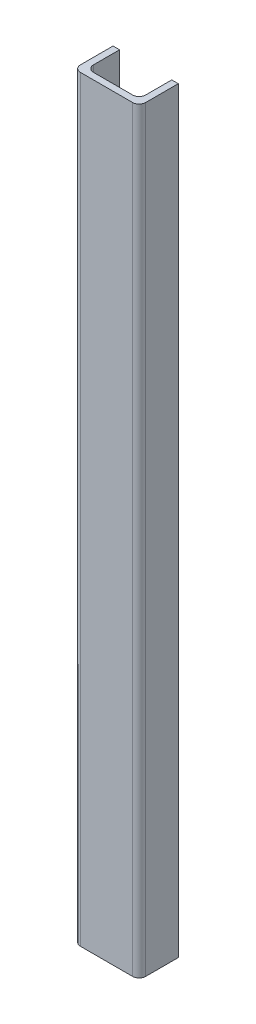
ISO-10303-21;
HEADER;
FILE_DESCRIPTION(('STEP AP214'),'2;1');
FILE_NAME('part.step','',(''),(''),'','','');
FILE_SCHEMA(('AUTOMOTIVE_DESIGN { 1 0 10303 214 1 1 1 1 }'));
ENDSEC;
DATA;
#1=APPLICATION_CONTEXT('core data for automotive mechanical design processes');
#2=APPLICATION_PROTOCOL_DEFINITION('international standard','automotive_design',2000,#1);
#3=PRODUCT_CONTEXT('',#1,'mechanical');
#4=PRODUCT('Part','Part','',(#3));
#5=PRODUCT_RELATED_PRODUCT_CATEGORY('part','',(#4));
#6=PRODUCT_DEFINITION_FORMATION('','',#4);
#7=PRODUCT_DEFINITION_CONTEXT('part definition',#1,'design');
#8=PRODUCT_DEFINITION('design','',#6,#7);
#9=PRODUCT_DEFINITION_SHAPE('','',#8);
#10=(LENGTH_UNIT() NAMED_UNIT(*) SI_UNIT(.MILLI.,.METRE.));
#11=(NAMED_UNIT(*) PLANE_ANGLE_UNIT() SI_UNIT($,.RADIAN.));
#12=(NAMED_UNIT(*) SI_UNIT($,.STERADIAN.) SOLID_ANGLE_UNIT());
#13=UNCERTAINTY_MEASURE_WITH_UNIT(LENGTH_MEASURE(1.E-05),#10,'distance_accuracy_value','');
#14=(GEOMETRIC_REPRESENTATION_CONTEXT(3) GLOBAL_UNCERTAINTY_ASSIGNED_CONTEXT((#13)) GLOBAL_UNIT_ASSIGNED_CONTEXT((#10,
#11,#12)) REPRESENTATION_CONTEXT('',''));
#15=CARTESIAN_POINT('',(0.,0.,0.));
#16=DIRECTION('',(0.,0.,1.));
#17=DIRECTION('',(1.,0.,0.));
#18=AXIS2_PLACEMENT_3D('',#15,#16,#17);
#19=CARTESIAN_POINT('',(20.,580.,-2.5));
#20=DIRECTION('',(0.,-1.,0.));
#21=DIRECTION('',(0.,0.,-1.));
#22=AXIS2_PLACEMENT_3D('',#19,#20,#21);
#23=CYLINDRICAL_SURFACE('',#22,5.);
#24=CARTESIAN_POINT('',(20.,0.,-2.5));
#25=DIRECTION('',(0.,1.,0.));
#26=DIRECTION('',(0.,0.,1.));
#27=AXIS2_PLACEMENT_3D('',#24,#25,#26);
#28=CIRCLE('',#27,5.);
#29=CARTESIAN_POINT('',(20.,0.,2.5));
#30=VERTEX_POINT('',#29);
#31=CARTESIAN_POINT('',(25.,0.,-2.50000000000004));
#32=VERTEX_POINT('',#31);
#33=EDGE_CURVE('E157',#30,#32,#28,.T.);
#34=ORIENTED_EDGE('',*,*,#33,.T.);
#35=DIRECTION('',(0.,-1.,0.));
#36=VECTOR('',#35,1.);
#37=CARTESIAN_POINT('',(25.,580.,-2.50000000000004));
#38=LINE('',#37,#36);
#39=CARTESIAN_POINT('',(25.,580.,-2.50000000000004));
#40=VERTEX_POINT('',#39);
#41=EDGE_CURVE('E11',#40,#32,#38,.T.);
#42=ORIENTED_EDGE('',*,*,#41,.F.);
#43=CARTESIAN_POINT('',(20.,580.,-2.5));
#44=DIRECTION('',(0.,1.,0.));
#45=DIRECTION('',(0.,0.,1.));
#46=AXIS2_PLACEMENT_3D('',#43,#44,#45);
#47=CIRCLE('',#46,5.);
#48=CARTESIAN_POINT('',(20.,580.,2.5));
#49=VERTEX_POINT('',#48);
#50=EDGE_CURVE('E179',#49,#40,#47,.T.);
#51=ORIENTED_EDGE('',*,*,#50,.F.);
#52=DIRECTION('',(0.,-1.,0.));
#53=VECTOR('',#52,1.);
#54=CARTESIAN_POINT('',(20.,580.,2.5));
#55=LINE('',#54,#53);
#56=EDGE_CURVE('E153',#49,#30,#55,.T.);
#57=ORIENTED_EDGE('',*,*,#56,.T.);
#58=EDGE_LOOP('',(#34,#42,#51,#57));
#59=FACE_BOUND('',#58,.T.);
#60=ADVANCED_FACE('F37',(#59),#23,.T.);
#61=CARTESIAN_POINT('',(25.,580.,-2.50000000000004));
#62=DIRECTION('',(-1.,0.,0.));
#63=DIRECTION('',(0.,0.,1.));
#64=AXIS2_PLACEMENT_3D('',#61,#62,#63);
#65=PLANE('',#64);
#66=DIRECTION('',(0.,0.,-1.));
#67=VECTOR('',#66,1.);
#68=CARTESIAN_POINT('',(25.,0.,-2.50000000000004));
#69=LINE('',#68,#67);
#70=CARTESIAN_POINT('',(25.,0.,-27.5));
#71=VERTEX_POINT('',#70);
#72=EDGE_CURVE('E160',#32,#71,#69,.T.);
#73=ORIENTED_EDGE('',*,*,#72,.T.);
#74=DIRECTION('',(0.,-1.,0.));
#75=VECTOR('',#74,1.);
#76=CARTESIAN_POINT('',(25.,580.,-27.5));
#77=LINE('',#76,#75);
#78=CARTESIAN_POINT('',(25.,580.,-27.5));
#79=VERTEX_POINT('',#78);
#80=EDGE_CURVE('E45',#79,#71,#77,.T.);
#81=ORIENTED_EDGE('',*,*,#80,.F.);
#82=DIRECTION('',(0.,0.,-1.));
#83=VECTOR('',#82,1.);
#84=CARTESIAN_POINT('',(25.,580.,-2.50000000000004));
#85=LINE('',#84,#83);
#86=EDGE_CURVE('E108',#40,#79,#85,.T.);
#87=ORIENTED_EDGE('',*,*,#86,.F.);
#88=ORIENTED_EDGE('',*,*,#41,.T.);
#89=EDGE_LOOP('',(#73,#81,#87,#88));
#90=FACE_BOUND('',#89,.T.);
#91=ADVANCED_FACE('F257',(#90),#65,.F.);
#92=CARTESIAN_POINT('',(25.,580.,-27.5));
#93=DIRECTION('',(0.,0.,1.));
#94=DIRECTION('',(1.,0.,0.));
#95=AXIS2_PLACEMENT_3D('',#92,#93,#94);
#96=PLANE('',#95);
#97=DIRECTION('',(-1.,0.,0.));
#98=VECTOR('',#97,1.);
#99=CARTESIAN_POINT('',(25.,0.,-27.5));
#100=LINE('',#99,#98);
#101=CARTESIAN_POINT('',(20.,0.,-27.5));
#102=VERTEX_POINT('',#101);
#103=EDGE_CURVE('E162',#71,#102,#100,.T.);
#104=ORIENTED_EDGE('',*,*,#103,.T.);
#105=DIRECTION('',(0.,-1.,0.));
#106=VECTOR('',#105,1.);
#107=CARTESIAN_POINT('',(20.,580.,-27.5));
#108=LINE('',#107,#106);
#109=CARTESIAN_POINT('',(20.,580.,-27.5));
#110=VERTEX_POINT('',#109);
#111=EDGE_CURVE('E198',#110,#102,#108,.T.);
#112=ORIENTED_EDGE('',*,*,#111,.F.);
#113=DIRECTION('',(-1.,0.,0.));
#114=VECTOR('',#113,1.);
#115=CARTESIAN_POINT('',(25.,580.,-27.5));
#116=LINE('',#115,#114);
#117=EDGE_CURVE('E206',#79,#110,#116,.T.);
#118=ORIENTED_EDGE('',*,*,#117,.F.);
#119=ORIENTED_EDGE('',*,*,#80,.T.);
#120=EDGE_LOOP('',(#104,#112,#118,#119));
#121=FACE_BOUND('',#120,.T.);
#122=ADVANCED_FACE('F204',(#121),#96,.F.);
#123=CARTESIAN_POINT('',(20.,580.,-7.50000000000003));
#124=DIRECTION('',(1.,0.,0.));
#125=DIRECTION('',(0.,0.,-1.));
#126=AXIS2_PLACEMENT_3D('',#123,#124,#125);
#127=PLANE('',#126);
#128=DIRECTION('',(0.,0.,1.));
#129=VECTOR('',#128,1.);
#130=CARTESIAN_POINT('',(20.,0.,-7.50000000000003));
#131=LINE('',#130,#129);
#132=CARTESIAN_POINT('',(20.,0.,-7.50000000000003));
#133=VERTEX_POINT('',#132);
#134=EDGE_CURVE('E164',#102,#133,#131,.T.);
#135=ORIENTED_EDGE('',*,*,#134,.T.);
#136=DIRECTION('',(0.,-1.,0.));
#137=VECTOR('',#136,1.);
#138=CARTESIAN_POINT('',(20.,580.,-7.50000000000003));
#139=LINE('',#138,#137);
#140=CARTESIAN_POINT('',(20.,580.,-7.50000000000003));
#141=VERTEX_POINT('',#140);
#142=EDGE_CURVE('E195',#141,#133,#139,.T.);
#143=ORIENTED_EDGE('',*,*,#142,.F.);
#144=DIRECTION('',(0.,0.,1.));
#145=VECTOR('',#144,1.);
#146=CARTESIAN_POINT('',(20.,580.,-7.50000000000003));
#147=LINE('',#146,#145);
#148=EDGE_CURVE('E224',#110,#141,#147,.T.);
#149=ORIENTED_EDGE('',*,*,#148,.F.);
#150=ORIENTED_EDGE('',*,*,#111,.T.);
#151=EDGE_LOOP('',(#135,#143,#149,#150));
#152=FACE_BOUND('',#151,.T.);
#153=ADVANCED_FACE('F215',(#152),#127,.F.);
#154=CARTESIAN_POINT('',(15.,580.,-7.5));
#155=DIRECTION('',(0.,-1.,0.));
#156=DIRECTION('',(0.,0.,-1.));
#157=AXIS2_PLACEMENT_3D('',#154,#155,#156);
#158=CYLINDRICAL_SURFACE('',#157,5.);
#159=CARTESIAN_POINT('',(15.,0.,-7.5));
#160=DIRECTION('',(0.,-1.,0.));
#161=DIRECTION('',(0.,0.,1.));
#162=AXIS2_PLACEMENT_3D('',#159,#160,#161);
#163=CIRCLE('',#162,5.);
#164=CARTESIAN_POINT('',(15.,0.,-2.5));
#165=VERTEX_POINT('',#164);
#166=EDGE_CURVE('E166',#133,#165,#163,.T.);
#167=ORIENTED_EDGE('',*,*,#166,.T.);
#168=DIRECTION('',(0.,-1.,0.));
#169=VECTOR('',#168,1.);
#170=CARTESIAN_POINT('',(15.,580.,-2.5));
#171=LINE('',#170,#169);
#172=CARTESIAN_POINT('',(15.,580.,-2.5));
#173=VERTEX_POINT('',#172);
#174=EDGE_CURVE('E192',#173,#165,#171,.T.);
#175=ORIENTED_EDGE('',*,*,#174,.F.);
#176=CARTESIAN_POINT('',(15.,580.,-7.5));
#177=DIRECTION('',(0.,-1.,0.));
#178=DIRECTION('',(0.,0.,1.));
#179=AXIS2_PLACEMENT_3D('',#176,#177,#178);
#180=CIRCLE('',#179,5.);
#181=EDGE_CURVE('E221',#141,#173,#180,.T.);
#182=ORIENTED_EDGE('',*,*,#181,.F.);
#183=ORIENTED_EDGE('',*,*,#142,.T.);
#184=EDGE_LOOP('',(#167,#175,#182,#183));
#185=FACE_BOUND('',#184,.T.);
#186=ADVANCED_FACE('F219',(#185),#158,.F.);
#187=CARTESIAN_POINT('',(-15.,580.,-2.5));
#188=DIRECTION('',(0.,0.,1.));
#189=DIRECTION('',(1.,0.,0.));
#190=AXIS2_PLACEMENT_3D('',#187,#188,#189);
#191=PLANE('',#190);
#192=DIRECTION('',(-1.,0.,0.));
#193=VECTOR('',#192,1.);
#194=CARTESIAN_POINT('',(-15.,0.,-2.5));
#195=LINE('',#194,#193);
#196=CARTESIAN_POINT('',(-15.,0.,-2.5));
#197=VERTEX_POINT('',#196);
#198=EDGE_CURVE('E168',#165,#197,#195,.T.);
#199=ORIENTED_EDGE('',*,*,#198,.T.);
#200=DIRECTION('',(0.,-1.,0.));
#201=VECTOR('',#200,1.);
#202=CARTESIAN_POINT('',(-15.,580.,-2.5));
#203=LINE('',#202,#201);
#204=CARTESIAN_POINT('',(-15.,580.,-2.5));
#205=VERTEX_POINT('',#204);
#206=EDGE_CURVE('E189',#205,#197,#203,.T.);
#207=ORIENTED_EDGE('',*,*,#206,.F.);
#208=DIRECTION('',(-1.,0.,0.));
#209=VECTOR('',#208,1.);
#210=CARTESIAN_POINT('',(-15.,580.,-2.5));
#211=LINE('',#210,#209);
#212=EDGE_CURVE('E223',#173,#205,#211,.T.);
#213=ORIENTED_EDGE('',*,*,#212,.F.);
#214=ORIENTED_EDGE('',*,*,#174,.T.);
#215=EDGE_LOOP('',(#199,#207,#213,#214));
#216=FACE_BOUND('',#215,.T.);
#217=ADVANCED_FACE('F270',(#216),#191,.F.);
#218=CARTESIAN_POINT('',(-15.,580.,-7.5));
#219=DIRECTION('',(0.,-1.,0.));
#220=DIRECTION('',(0.,0.,-1.));
#221=AXIS2_PLACEMENT_3D('',#218,#219,#220);
#222=CYLINDRICAL_SURFACE('',#221,5.);
#223=CARTESIAN_POINT('',(-15.,0.,-7.5));
#224=DIRECTION('',(0.,-1.,0.));
#225=DIRECTION('',(0.,0.,-1.));
#226=AXIS2_PLACEMENT_3D('',#223,#224,#225);
#227=CIRCLE('',#226,5.);
#228=CARTESIAN_POINT('',(-20.,0.,-7.50000000000003));
#229=VERTEX_POINT('',#228);
#230=EDGE_CURVE('E170',#197,#229,#227,.T.);
#231=ORIENTED_EDGE('',*,*,#230,.T.);
#232=DIRECTION('',(0.,-1.,0.));
#233=VECTOR('',#232,1.);
#234=CARTESIAN_POINT('',(-20.,580.,-7.50000000000003));
#235=LINE('',#234,#233);
#236=CARTESIAN_POINT('',(-20.,580.,-7.50000000000003));
#237=VERTEX_POINT('',#236);
#238=EDGE_CURVE('E186',#237,#229,#235,.T.);
#239=ORIENTED_EDGE('',*,*,#238,.F.);
#240=CARTESIAN_POINT('',(-15.,580.,-7.5));
#241=DIRECTION('',(0.,-1.,0.));
#242=DIRECTION('',(0.,0.,-1.));
#243=AXIS2_PLACEMENT_3D('',#240,#241,#242);
#244=CIRCLE('',#243,5.);
#245=EDGE_CURVE('E226',#205,#237,#244,.T.);
#246=ORIENTED_EDGE('',*,*,#245,.F.);
#247=ORIENTED_EDGE('',*,*,#206,.T.);
#248=EDGE_LOOP('',(#231,#239,#246,#247));
#249=FACE_BOUND('',#248,.T.);
#250=ADVANCED_FACE('F273',(#249),#222,.F.);
#251=CARTESIAN_POINT('',(-20.,580.,-27.5));
#252=DIRECTION('',(-1.,0.,0.));
#253=DIRECTION('',(0.,0.,1.));
#254=AXIS2_PLACEMENT_3D('',#251,#252,#253);
#255=PLANE('',#254);
#256=DIRECTION('',(0.,0.,-1.));
#257=VECTOR('',#256,1.);
#258=CARTESIAN_POINT('',(-20.,0.,-27.5));
#259=LINE('',#258,#257);
#260=CARTESIAN_POINT('',(-20.,0.,-27.5));
#261=VERTEX_POINT('',#260);
#262=EDGE_CURVE('E172',#229,#261,#259,.T.);
#263=ORIENTED_EDGE('',*,*,#262,.T.);
#264=DIRECTION('',(0.,-1.,0.));
#265=VECTOR('',#264,1.);
#266=CARTESIAN_POINT('',(-20.,580.,-27.5));
#267=LINE('',#266,#265);
#268=CARTESIAN_POINT('',(-20.,580.,-27.5));
#269=VERTEX_POINT('',#268);
#270=EDGE_CURVE('E183',#269,#261,#267,.T.);
#271=ORIENTED_EDGE('',*,*,#270,.F.);
#272=DIRECTION('',(0.,0.,-1.));
#273=VECTOR('',#272,1.);
#274=CARTESIAN_POINT('',(-20.,580.,-27.5));
#275=LINE('',#274,#273);
#276=EDGE_CURVE('E232',#237,#269,#275,.T.);
#277=ORIENTED_EDGE('',*,*,#276,.F.);
#278=ORIENTED_EDGE('',*,*,#238,.T.);
#279=EDGE_LOOP('',(#263,#271,#277,#278));
#280=FACE_BOUND('',#279,.T.);
#281=ADVANCED_FACE('F238',(#280),#255,.F.);
#282=CARTESIAN_POINT('',(-25.,580.,-27.5));
#283=DIRECTION('',(0.,0.,1.));
#284=DIRECTION('',(1.,0.,0.));
#285=AXIS2_PLACEMENT_3D('',#282,#283,#284);
#286=PLANE('',#285);
#287=DIRECTION('',(-1.,0.,0.));
#288=VECTOR('',#287,1.);
#289=CARTESIAN_POINT('',(-25.,0.,-27.5));
#290=LINE('',#289,#288);
#291=CARTESIAN_POINT('',(-25.,0.,-27.5));
#292=VERTEX_POINT('',#291);
#293=EDGE_CURVE('E174',#261,#292,#290,.T.);
#294=ORIENTED_EDGE('',*,*,#293,.T.);
#295=DIRECTION('',(0.,-1.,0.));
#296=VECTOR('',#295,1.);
#297=CARTESIAN_POINT('',(-25.,580.,-27.5));
#298=LINE('',#297,#296);
#299=CARTESIAN_POINT('',(-25.,580.,-27.5));
#300=VERTEX_POINT('',#299);
#301=EDGE_CURVE('E148',#300,#292,#298,.T.);
#302=ORIENTED_EDGE('',*,*,#301,.F.);
#303=DIRECTION('',(-1.,0.,0.));
#304=VECTOR('',#303,1.);
#305=CARTESIAN_POINT('',(-25.,580.,-27.5));
#306=LINE('',#305,#304);
#307=EDGE_CURVE('E139',#269,#300,#306,.T.);
#308=ORIENTED_EDGE('',*,*,#307,.F.);
#309=ORIENTED_EDGE('',*,*,#270,.T.);
#310=EDGE_LOOP('',(#294,#302,#308,#309));
#311=FACE_BOUND('',#310,.T.);
#312=ADVANCED_FACE('F242',(#311),#286,.F.);
#313=CARTESIAN_POINT('',(-25.,580.,-27.5));
#314=DIRECTION('',(1.,0.,0.));
#315=DIRECTION('',(0.,0.,-1.));
#316=AXIS2_PLACEMENT_3D('',#313,#314,#315);
#317=PLANE('',#316);
#318=DIRECTION('',(0.,0.,1.));
#319=VECTOR('',#318,1.);
#320=CARTESIAN_POINT('',(-25.,0.,-27.5));
#321=LINE('',#320,#319);
#322=CARTESIAN_POINT('',(-25.,0.,-2.50000000000004));
#323=VERTEX_POINT('',#322);
#324=EDGE_CURVE('E147',#292,#323,#321,.T.);
#325=ORIENTED_EDGE('',*,*,#324,.T.);
#326=DIRECTION('',(0.,-1.,0.));
#327=VECTOR('',#326,1.);
#328=CARTESIAN_POINT('',(-25.,580.,-2.50000000000004));
#329=LINE('',#328,#327);
#330=CARTESIAN_POINT('',(-25.,580.,-2.50000000000004));
#331=VERTEX_POINT('',#330);
#332=EDGE_CURVE('E144',#331,#323,#329,.T.);
#333=ORIENTED_EDGE('',*,*,#332,.F.);
#334=DIRECTION('',(0.,0.,1.));
#335=VECTOR('',#334,1.);
#336=CARTESIAN_POINT('',(-25.,580.,-27.5));
#337=LINE('',#336,#335);
#338=EDGE_CURVE('E133',#300,#331,#337,.T.);
#339=ORIENTED_EDGE('',*,*,#338,.F.);
#340=ORIENTED_EDGE('',*,*,#301,.T.);
#341=EDGE_LOOP('',(#325,#333,#339,#340));
#342=FACE_BOUND('',#341,.T.);
#343=ADVANCED_FACE('F145',(#342),#317,.F.);
#344=CARTESIAN_POINT('',(-20.,580.,-2.5));
#345=DIRECTION('',(0.,-1.,0.));
#346=DIRECTION('',(0.,0.,-1.));
#347=AXIS2_PLACEMENT_3D('',#344,#345,#346);
#348=CYLINDRICAL_SURFACE('',#347,5.);
#349=CARTESIAN_POINT('',(-20.,0.,-2.5));
#350=DIRECTION('',(0.,1.,0.));
#351=DIRECTION('',(0.,0.,1.));
#352=AXIS2_PLACEMENT_3D('',#349,#350,#351);
#353=CIRCLE('',#352,5.);
#354=CARTESIAN_POINT('',(-20.,0.,2.5));
#355=VERTEX_POINT('',#354);
#356=EDGE_CURVE('E94',#323,#355,#353,.T.);
#357=ORIENTED_EDGE('',*,*,#356,.T.);
#358=DIRECTION('',(0.,-1.,0.));
#359=VECTOR('',#358,1.);
#360=CARTESIAN_POINT('',(-20.,580.,2.5));
#361=LINE('',#360,#359);
#362=CARTESIAN_POINT('',(-20.,580.,2.5));
#363=VERTEX_POINT('',#362);
#364=EDGE_CURVE('E149',#363,#355,#361,.T.);
#365=ORIENTED_EDGE('',*,*,#364,.F.);
#366=CARTESIAN_POINT('',(-20.,580.,-2.5));
#367=DIRECTION('',(0.,1.,0.));
#368=DIRECTION('',(0.,0.,1.));
#369=AXIS2_PLACEMENT_3D('',#366,#367,#368);
#370=CIRCLE('',#369,5.);
#371=EDGE_CURVE('E137',#331,#363,#370,.T.);
#372=ORIENTED_EDGE('',*,*,#371,.F.);
#373=ORIENTED_EDGE('',*,*,#332,.T.);
#374=EDGE_LOOP('',(#357,#365,#372,#373));
#375=FACE_BOUND('',#374,.T.);
#376=ADVANCED_FACE('F151',(#375),#348,.T.);
#377=CARTESIAN_POINT('',(-20.,580.,2.5));
#378=DIRECTION('',(0.,0.,-1.));
#379=DIRECTION('',(-1.,0.,0.));
#380=AXIS2_PLACEMENT_3D('',#377,#378,#379);
#381=PLANE('',#380);
#382=DIRECTION('',(1.,0.,0.));
#383=VECTOR('',#382,1.);
#384=CARTESIAN_POINT('',(-20.,0.,2.5));
#385=LINE('',#384,#383);
#386=EDGE_CURVE('E100',#355,#30,#385,.T.);
#387=ORIENTED_EDGE('',*,*,#386,.T.);
#388=ORIENTED_EDGE('',*,*,#56,.F.);
#389=DIRECTION('',(1.,0.,0.));
#390=VECTOR('',#389,1.);
#391=CARTESIAN_POINT('',(-20.,580.,2.5));
#392=LINE('',#391,#390);
#393=EDGE_CURVE('E53',#363,#49,#392,.T.);
#394=ORIENTED_EDGE('',*,*,#393,.F.);
#395=ORIENTED_EDGE('',*,*,#364,.T.);
#396=EDGE_LOOP('',(#387,#388,#394,#395));
#397=FACE_BOUND('',#396,.T.);
#398=ADVANCED_FACE('F246',(#397),#381,.F.);
#399=CARTESIAN_POINT('',(20.,580.,-2.5));
#400=DIRECTION('',(0.,1.,0.));
#401=DIRECTION('',(0.,0.,1.));
#402=AXIS2_PLACEMENT_3D('',#399,#400,#401);
#403=PLANE('',#402);
#404=ORIENTED_EDGE('',*,*,#50,.T.);
#405=ORIENTED_EDGE('',*,*,#86,.T.);
#406=ORIENTED_EDGE('',*,*,#117,.T.);
#407=ORIENTED_EDGE('',*,*,#148,.T.);
#408=ORIENTED_EDGE('',*,*,#181,.T.);
#409=ORIENTED_EDGE('',*,*,#212,.T.);
#410=ORIENTED_EDGE('',*,*,#245,.T.);
#411=ORIENTED_EDGE('',*,*,#276,.T.);
#412=ORIENTED_EDGE('',*,*,#307,.T.);
#413=ORIENTED_EDGE('',*,*,#338,.T.);
#414=ORIENTED_EDGE('',*,*,#371,.T.);
#415=ORIENTED_EDGE('',*,*,#393,.T.);
#416=EDGE_LOOP('',(#404,#405,#406,#407,#408,#409,#410,#411,#412,#413,#414,#415));
#417=FACE_BOUND('',#416,.T.);
#418=ADVANCED_FACE('F135',(#417),#403,.T.);
#419=CARTESIAN_POINT('',(20.,0.,-2.5));
#420=DIRECTION('',(0.,1.,0.));
#421=DIRECTION('',(0.,0.,1.));
#422=AXIS2_PLACEMENT_3D('',#419,#420,#421);
#423=PLANE('',#422);
#424=ORIENTED_EDGE('',*,*,#33,.F.);
#425=ORIENTED_EDGE('',*,*,#386,.F.);
#426=ORIENTED_EDGE('',*,*,#356,.F.);
#427=ORIENTED_EDGE('',*,*,#324,.F.);
#428=ORIENTED_EDGE('',*,*,#293,.F.);
#429=ORIENTED_EDGE('',*,*,#262,.F.);
#430=ORIENTED_EDGE('',*,*,#230,.F.);
#431=ORIENTED_EDGE('',*,*,#198,.F.);
#432=ORIENTED_EDGE('',*,*,#166,.F.);
#433=ORIENTED_EDGE('',*,*,#134,.F.);
#434=ORIENTED_EDGE('',*,*,#103,.F.);
#435=ORIENTED_EDGE('',*,*,#72,.F.);
#436=EDGE_LOOP('',(#424,#425,#426,#427,#428,#429,#430,#431,#432,#433,#434,#435));
#437=FACE_BOUND('',#436,.T.);
#438=ADVANCED_FACE('F210',(#437),#423,.F.);
#439=CLOSED_SHELL('',(#60,#91,#122,#153,#186,#217,#250,#281,#312,#343,#376,#398,#418,#438));
#440=MANIFOLD_SOLID_BREP('B2',#439);
#441=ADVANCED_BREP_SHAPE_REPRESENTATION('',(#18,#440),#14);
#442=SHAPE_DEFINITION_REPRESENTATION(#9,#441);
ENDSEC;
END-ISO-10303-21;
